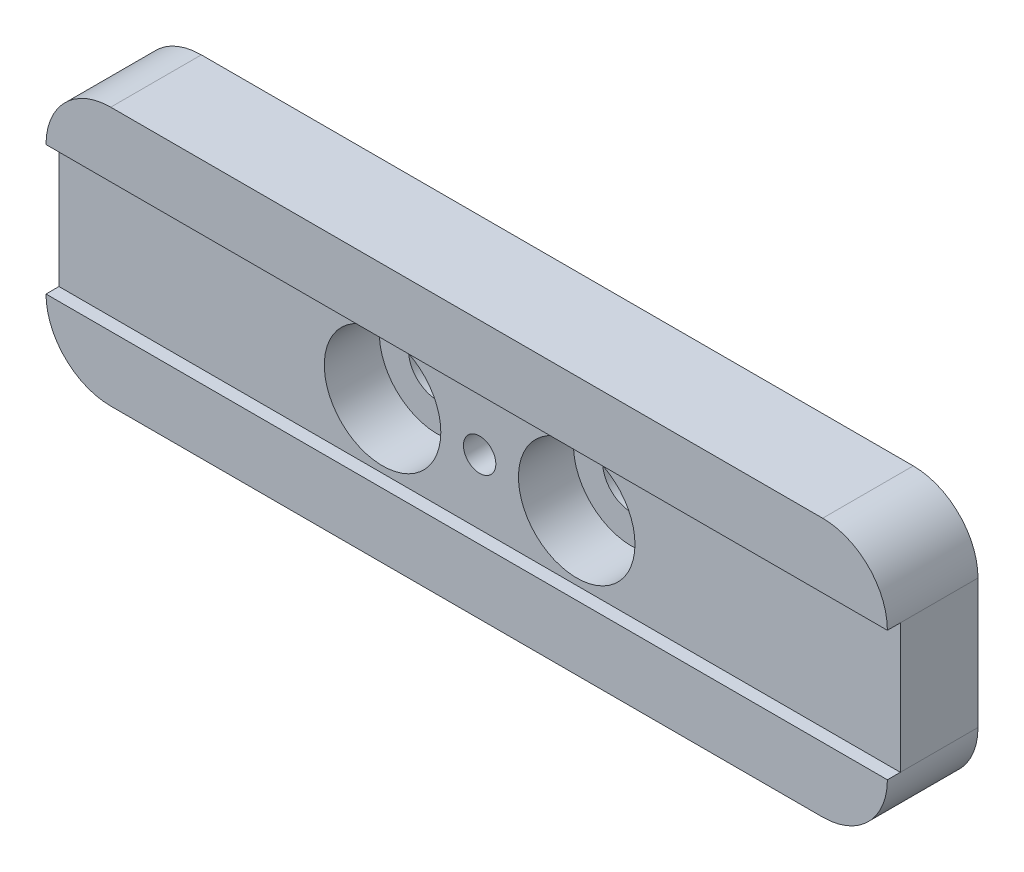
ISO-10303-21;
HEADER;
FILE_DESCRIPTION(('STEP AP214'),'2;1');
FILE_NAME('part.step','',(''),(''),'','','');
FILE_SCHEMA(('AUTOMOTIVE_DESIGN { 1 0 10303 214 1 1 1 1 }'));
ENDSEC;
DATA;
#1=APPLICATION_CONTEXT('core data for automotive mechanical design processes');
#2=APPLICATION_PROTOCOL_DEFINITION('international standard','automotive_design',2000,#1);
#3=PRODUCT_CONTEXT('',#1,'mechanical');
#4=PRODUCT('Part','Part','',(#3));
#5=PRODUCT_RELATED_PRODUCT_CATEGORY('part','',(#4));
#6=PRODUCT_DEFINITION_FORMATION('','',#4);
#7=PRODUCT_DEFINITION_CONTEXT('part definition',#1,'design');
#8=PRODUCT_DEFINITION('design','',#6,#7);
#9=PRODUCT_DEFINITION_SHAPE('','',#8);
#10=(LENGTH_UNIT() NAMED_UNIT(*) SI_UNIT(.MILLI.,.METRE.));
#11=(NAMED_UNIT(*) PLANE_ANGLE_UNIT() SI_UNIT($,.RADIAN.));
#12=(NAMED_UNIT(*) SI_UNIT($,.STERADIAN.) SOLID_ANGLE_UNIT());
#13=UNCERTAINTY_MEASURE_WITH_UNIT(LENGTH_MEASURE(1.E-05),#10,'distance_accuracy_value','');
#14=(GEOMETRIC_REPRESENTATION_CONTEXT(3) GLOBAL_UNCERTAINTY_ASSIGNED_CONTEXT((#13)) GLOBAL_UNIT_ASSIGNED_CONTEXT((#10,
#11,#12)) REPRESENTATION_CONTEXT('',''));
#15=CARTESIAN_POINT('',(0.,0.,0.));
#16=DIRECTION('',(0.,0.,1.));
#17=DIRECTION('',(1.,0.,0.));
#18=AXIS2_PLACEMENT_3D('',#15,#16,#17);
#19=CARTESIAN_POINT('',(-65.,0.,14.));
#20=DIRECTION('',(0.,0.,1.));
#21=DIRECTION('',(1.,0.,0.));
#22=AXIS2_PLACEMENT_3D('',#19,#20,#21);
#23=PLANE('',#22);
#24=DIRECTION('',(1.,0.,0.));
#25=VECTOR('',#24,1.);
#26=CARTESIAN_POINT('',(-65.,0.,14.));
#27=LINE('',#26,#25);
#28=CARTESIAN_POINT('',(-55.,0.,14.));
#29=VERTEX_POINT('',#28);
#30=CARTESIAN_POINT('',(55.,0.,14.));
#31=VERTEX_POINT('',#30);
#32=EDGE_CURVE('E159',#29,#31,#27,.T.);
#33=ORIENTED_EDGE('',*,*,#32,.T.);
#34=CARTESIAN_POINT('',(55.,10.,14.));
#35=DIRECTION('',(0.,0.,1.));
#36=DIRECTION('',(1.,0.,0.));
#37=AXIS2_PLACEMENT_3D('',#34,#35,#36);
#38=CIRCLE('',#37,10.);
#39=CARTESIAN_POINT('',(65.,10.,14.));
#40=VERTEX_POINT('',#39);
#41=EDGE_CURVE('E190',#31,#40,#38,.T.);
#42=ORIENTED_EDGE('',*,*,#41,.T.);
#43=DIRECTION('',(1.,0.,0.));
#44=VECTOR('',#43,1.);
#45=CARTESIAN_POINT('',(-65.,10.,14.));
#46=LINE('',#45,#44);
#47=CARTESIAN_POINT('',(-65.,10.,14.));
#48=VERTEX_POINT('',#47);
#49=EDGE_CURVE('E144',#48,#40,#46,.T.);
#50=ORIENTED_EDGE('',*,*,#49,.F.);
#51=CARTESIAN_POINT('',(-55.,10.,14.));
#52=DIRECTION('',(0.,0.,1.));
#53=DIRECTION('',(1.,0.,0.));
#54=AXIS2_PLACEMENT_3D('',#51,#52,#53);
#55=CIRCLE('',#54,10.);
#56=EDGE_CURVE('E188',#48,#29,#55,.T.);
#57=ORIENTED_EDGE('',*,*,#56,.T.);
#58=EDGE_LOOP('',(#33,#42,#50,#57));
#59=FACE_BOUND('',#58,.T.);
#60=ADVANCED_FACE('F34',(#59),#23,.T.);
#61=CARTESIAN_POINT('',(-65.,40.,14.));
#62=DIRECTION('',(1.,0.,0.));
#63=DIRECTION('',(0.,0.,-1.));
#64=AXIS2_PLACEMENT_3D('',#61,#62,#63);
#65=PLANE('',#64);
#66=DIRECTION('',(0.,-1.,0.));
#67=VECTOR('',#66,1.);
#68=CARTESIAN_POINT('',(-65.,40.,0.));
#69=LINE('',#68,#67);
#70=CARTESIAN_POINT('',(-65.,30.,0.));
#71=VERTEX_POINT('',#70);
#72=CARTESIAN_POINT('',(-65.,10.,0.));
#73=VERTEX_POINT('',#72);
#74=EDGE_CURVE('E157',#71,#73,#69,.T.);
#75=ORIENTED_EDGE('',*,*,#74,.T.);
#76=DIRECTION('',(0.,0.,-1.));
#77=VECTOR('',#76,1.);
#78=CARTESIAN_POINT('',(-65.,10.,14.));
#79=LINE('',#78,#77);
#80=CARTESIAN_POINT('',(-65.,10.,12.));
#81=VERTEX_POINT('',#80);
#82=EDGE_CURVE('E11',#73,#81,#79,.F.);
#83=ORIENTED_EDGE('',*,*,#82,.T.);
#84=DIRECTION('',(0.,-1.,0.));
#85=VECTOR('',#84,1.);
#86=CARTESIAN_POINT('',(-65.,10.,12.));
#87=LINE('',#86,#85);
#88=CARTESIAN_POINT('',(-65.,30.,12.));
#89=VERTEX_POINT('',#88);
#90=EDGE_CURVE('E137',#89,#81,#87,.T.);
#91=ORIENTED_EDGE('',*,*,#90,.F.);
#92=DIRECTION('',(0.,0.,-1.));
#93=VECTOR('',#92,1.);
#94=CARTESIAN_POINT('',(-65.,30.,14.));
#95=LINE('',#94,#93);
#96=EDGE_CURVE('E42',#89,#71,#95,.T.);
#97=ORIENTED_EDGE('',*,*,#96,.T.);
#98=EDGE_LOOP('',(#75,#83,#91,#97));
#99=FACE_BOUND('',#98,.T.);
#100=ADVANCED_FACE('F200',(#99),#65,.F.);
#101=CARTESIAN_POINT('',(-65.,0.,14.));
#102=DIRECTION('',(0.,1.,0.));
#103=DIRECTION('',(0.,0.,1.));
#104=AXIS2_PLACEMENT_3D('',#101,#102,#103);
#105=PLANE('',#104);
#106=DIRECTION('',(1.,0.,0.));
#107=VECTOR('',#106,1.);
#108=CARTESIAN_POINT('',(-65.,0.,0.));
#109=LINE('',#108,#107);
#110=CARTESIAN_POINT('',(-55.,0.,0.));
#111=VERTEX_POINT('',#110);
#112=CARTESIAN_POINT('',(55.,0.,0.));
#113=VERTEX_POINT('',#112);
#114=EDGE_CURVE('E166',#111,#113,#109,.T.);
#115=ORIENTED_EDGE('',*,*,#114,.T.);
#116=DIRECTION('',(0.,0.,-1.));
#117=VECTOR('',#116,1.);
#118=CARTESIAN_POINT('',(55.,0.,14.));
#119=LINE('',#118,#117);
#120=EDGE_CURVE('E186',#113,#31,#119,.F.);
#121=ORIENTED_EDGE('',*,*,#120,.T.);
#122=ORIENTED_EDGE('',*,*,#32,.F.);
#123=DIRECTION('',(0.,0.,-1.));
#124=VECTOR('',#123,1.);
#125=CARTESIAN_POINT('',(-55.,0.,14.));
#126=LINE('',#125,#124);
#127=EDGE_CURVE('E183',#29,#111,#126,.T.);
#128=ORIENTED_EDGE('',*,*,#127,.T.);
#129=EDGE_LOOP('',(#115,#121,#122,#128));
#130=FACE_BOUND('',#129,.T.);
#131=ADVANCED_FACE('F234',(#130),#105,.F.);
#132=CARTESIAN_POINT('',(65.,40.,14.));
#133=DIRECTION('',(-1.,0.,0.));
#134=DIRECTION('',(0.,0.,1.));
#135=AXIS2_PLACEMENT_3D('',#132,#133,#134);
#136=PLANE('',#135);
#137=DIRECTION('',(0.,1.,0.));
#138=VECTOR('',#137,1.);
#139=CARTESIAN_POINT('',(65.,10.,12.));
#140=LINE('',#139,#138);
#141=CARTESIAN_POINT('',(65.,10.,12.));
#142=VERTEX_POINT('',#141);
#143=CARTESIAN_POINT('',(65.,30.,12.));
#144=VERTEX_POINT('',#143);
#145=EDGE_CURVE('E117',#142,#144,#140,.T.);
#146=ORIENTED_EDGE('',*,*,#145,.F.);
#147=DIRECTION('',(0.,0.,-1.));
#148=VECTOR('',#147,1.);
#149=CARTESIAN_POINT('',(65.,10.,14.));
#150=LINE('',#149,#148);
#151=CARTESIAN_POINT('',(65.,10.,0.));
#152=VERTEX_POINT('',#151);
#153=EDGE_CURVE('E122',#142,#152,#150,.T.);
#154=ORIENTED_EDGE('',*,*,#153,.T.);
#155=DIRECTION('',(0.,1.,0.));
#156=VECTOR('',#155,1.);
#157=CARTESIAN_POINT('',(65.,40.,0.));
#158=LINE('',#157,#156);
#159=CARTESIAN_POINT('',(65.,30.,0.));
#160=VERTEX_POINT('',#159);
#161=EDGE_CURVE('E119',#152,#160,#158,.T.);
#162=ORIENTED_EDGE('',*,*,#161,.T.);
#163=DIRECTION('',(0.,0.,-1.));
#164=VECTOR('',#163,1.);
#165=CARTESIAN_POINT('',(65.,30.,14.));
#166=LINE('',#165,#164);
#167=EDGE_CURVE('E113',#160,#144,#166,.F.);
#168=ORIENTED_EDGE('',*,*,#167,.T.);
#169=EDGE_LOOP('',(#146,#154,#162,#168));
#170=FACE_BOUND('',#169,.T.);
#171=ADVANCED_FACE('F115',(#170),#136,.F.);
#172=CARTESIAN_POINT('',(-65.,40.,14.));
#173=DIRECTION('',(0.,-1.,0.));
#174=DIRECTION('',(0.,0.,-1.));
#175=AXIS2_PLACEMENT_3D('',#172,#173,#174);
#176=PLANE('',#175);
#177=DIRECTION('',(-1.,0.,0.));
#178=VECTOR('',#177,1.);
#179=CARTESIAN_POINT('',(-65.,40.,14.));
#180=LINE('',#179,#178);
#181=CARTESIAN_POINT('',(55.,40.,14.));
#182=VERTEX_POINT('',#181);
#183=CARTESIAN_POINT('',(-55.,40.,14.));
#184=VERTEX_POINT('',#183);
#185=EDGE_CURVE('E123',#182,#184,#180,.T.);
#186=ORIENTED_EDGE('',*,*,#185,.F.);
#187=DIRECTION('',(0.,0.,-1.));
#188=VECTOR('',#187,1.);
#189=CARTESIAN_POINT('',(55.,40.,14.));
#190=LINE('',#189,#188);
#191=CARTESIAN_POINT('',(55.,40.,0.));
#192=VERTEX_POINT('',#191);
#193=EDGE_CURVE('E193',#182,#192,#190,.T.);
#194=ORIENTED_EDGE('',*,*,#193,.T.);
#195=DIRECTION('',(-1.,0.,0.));
#196=VECTOR('',#195,1.);
#197=CARTESIAN_POINT('',(-65.,40.,0.));
#198=LINE('',#197,#196);
#199=CARTESIAN_POINT('',(-55.,40.,0.));
#200=VERTEX_POINT('',#199);
#201=EDGE_CURVE('E162',#192,#200,#198,.T.);
#202=ORIENTED_EDGE('',*,*,#201,.T.);
#203=DIRECTION('',(0.,0.,-1.));
#204=VECTOR('',#203,1.);
#205=CARTESIAN_POINT('',(-55.,40.,14.));
#206=LINE('',#205,#204);
#207=EDGE_CURVE('E49',#200,#184,#206,.F.);
#208=ORIENTED_EDGE('',*,*,#207,.T.);
#209=EDGE_LOOP('',(#186,#194,#202,#208));
#210=FACE_BOUND('',#209,.T.);
#211=ADVANCED_FACE('F259',(#210),#176,.F.);
#212=DIRECTION('',(-1.,0.,0.));
#213=VECTOR('',#212,1.);
#214=CARTESIAN_POINT('',(-65.,30.,14.));
#215=LINE('',#214,#213);
#216=CARTESIAN_POINT('',(65.,30.,14.));
#217=VERTEX_POINT('',#216);
#218=CARTESIAN_POINT('',(-65.,30.,14.));
#219=VERTEX_POINT('',#218);
#220=EDGE_CURVE('E210',#217,#219,#215,.T.);
#221=ORIENTED_EDGE('',*,*,#220,.F.);
#222=CARTESIAN_POINT('',(55.,30.,14.));
#223=DIRECTION('',(0.,0.,1.));
#224=DIRECTION('',(1.,0.,0.));
#225=AXIS2_PLACEMENT_3D('',#222,#223,#224);
#226=CIRCLE('',#225,10.);
#227=EDGE_CURVE('E56',#217,#182,#226,.T.);
#228=ORIENTED_EDGE('',*,*,#227,.T.);
#229=ORIENTED_EDGE('',*,*,#185,.T.);
#230=CARTESIAN_POINT('',(-55.,30.,14.));
#231=DIRECTION('',(0.,0.,1.));
#232=DIRECTION('',(1.,0.,0.));
#233=AXIS2_PLACEMENT_3D('',#230,#231,#232);
#234=CIRCLE('',#233,10.);
#235=EDGE_CURVE('E196',#184,#219,#234,.T.);
#236=ORIENTED_EDGE('',*,*,#235,.T.);
#237=EDGE_LOOP('',(#221,#228,#229,#236));
#238=FACE_BOUND('',#237,.T.);
#239=ADVANCED_FACE('F209',(#238),#23,.T.);
#240=CARTESIAN_POINT('',(-65.,0.,0.));
#241=DIRECTION('',(0.,0.,1.));
#242=DIRECTION('',(1.,0.,0.));
#243=AXIS2_PLACEMENT_3D('',#240,#241,#242);
#244=PLANE('',#243);
#245=CARTESIAN_POINT('',(-15.,20.,0.));
#246=DIRECTION('',(0.,0.,1.));
#247=DIRECTION('',(1.,0.,0.));
#248=AXIS2_PLACEMENT_3D('',#245,#246,#247);
#249=CIRCLE('',#248,4.5);
#250=CARTESIAN_POINT('',(-10.5,20.,0.));
#251=VERTEX_POINT('',#250);
#252=EDGE_CURVE('E439',#251,#251,#249,.T.);
#253=ORIENTED_EDGE('',*,*,#252,.T.);
#254=EDGE_LOOP('',(#253));
#255=FACE_BOUND('',#254,.T.);
#256=CARTESIAN_POINT('',(15.,20.,0.));
#257=DIRECTION('',(0.,0.,1.));
#258=DIRECTION('',(1.,0.,0.));
#259=AXIS2_PLACEMENT_3D('',#256,#257,#258);
#260=CIRCLE('',#259,4.5);
#261=CARTESIAN_POINT('',(19.5,20.,0.));
#262=VERTEX_POINT('',#261);
#263=EDGE_CURVE('E211',#262,#262,#260,.T.);
#264=ORIENTED_EDGE('',*,*,#263,.T.);
#265=EDGE_LOOP('',(#264));
#266=FACE_BOUND('',#265,.T.);
#267=CARTESIAN_POINT('',(0.,20.,0.));
#268=DIRECTION('',(0.,0.,1.));
#269=DIRECTION('',(1.,0.,0.));
#270=AXIS2_PLACEMENT_3D('',#267,#268,#269);
#271=CIRCLE('',#270,2.5);
#272=CARTESIAN_POINT('',(2.5,20.,0.));
#273=VERTEX_POINT('',#272);
#274=EDGE_CURVE('E154',#273,#273,#271,.T.);
#275=ORIENTED_EDGE('',*,*,#274,.T.);
#276=EDGE_LOOP('',(#275));
#277=FACE_BOUND('',#276,.T.);
#278=ORIENTED_EDGE('',*,*,#161,.F.);
#279=CARTESIAN_POINT('',(55.,10.,0.));
#280=DIRECTION('',(0.,0.,1.));
#281=DIRECTION('',(1.,0.,0.));
#282=AXIS2_PLACEMENT_3D('',#279,#280,#281);
#283=CIRCLE('',#282,10.);
#284=EDGE_CURVE('E181',#152,#113,#283,.F.);
#285=ORIENTED_EDGE('',*,*,#284,.T.);
#286=ORIENTED_EDGE('',*,*,#114,.F.);
#287=CARTESIAN_POINT('',(-55.,10.,0.));
#288=DIRECTION('',(0.,0.,1.));
#289=DIRECTION('',(1.,0.,0.));
#290=AXIS2_PLACEMENT_3D('',#287,#288,#289);
#291=CIRCLE('',#290,10.);
#292=EDGE_CURVE('E177',#111,#73,#291,.F.);
#293=ORIENTED_EDGE('',*,*,#292,.T.);
#294=ORIENTED_EDGE('',*,*,#74,.F.);
#295=CARTESIAN_POINT('',(-55.,30.,0.));
#296=DIRECTION('',(0.,0.,1.));
#297=DIRECTION('',(1.,0.,0.));
#298=AXIS2_PLACEMENT_3D('',#295,#296,#297);
#299=CIRCLE('',#298,10.);
#300=EDGE_CURVE('E175',#71,#200,#299,.F.);
#301=ORIENTED_EDGE('',*,*,#300,.T.);
#302=ORIENTED_EDGE('',*,*,#201,.F.);
#303=CARTESIAN_POINT('',(55.,30.,0.));
#304=DIRECTION('',(0.,0.,1.));
#305=DIRECTION('',(1.,0.,0.));
#306=AXIS2_PLACEMENT_3D('',#303,#304,#305);
#307=CIRCLE('',#306,10.);
#308=EDGE_CURVE('E179',#192,#160,#307,.F.);
#309=ORIENTED_EDGE('',*,*,#308,.T.);
#310=EDGE_LOOP('',(#278,#285,#286,#293,#294,#301,#302,#309));
#311=FACE_BOUND('',#310,.T.);
#312=ADVANCED_FACE('F205',(#255,#266,#277,#311),#244,.F.);
#313=CARTESIAN_POINT('',(0.,20.,14.));
#314=DIRECTION('',(0.,0.,1.));
#315=DIRECTION('',(1.,0.,0.));
#316=AXIS2_PLACEMENT_3D('',#313,#314,#315);
#317=CYLINDRICAL_SURFACE('',#316,2.5);
#318=CARTESIAN_POINT('',(0.,20.,12.));
#319=DIRECTION('',(0.,0.,-1.));
#320=DIRECTION('',(-1.,0.,0.));
#321=AXIS2_PLACEMENT_3D('',#318,#319,#320);
#322=CIRCLE('',#321,2.5);
#323=CARTESIAN_POINT('',(-2.5,20.,12.));
#324=VERTEX_POINT('',#323);
#325=EDGE_CURVE('E158',#324,#324,#322,.F.);
#326=ORIENTED_EDGE('',*,*,#325,.T.);
#327=EDGE_LOOP('',(#326));
#328=FACE_BOUND('',#327,.T.);
#329=ORIENTED_EDGE('',*,*,#274,.F.);
#330=EDGE_LOOP('',(#329));
#331=FACE_BOUND('',#330,.T.);
#332=ADVANCED_FACE('F264',(#328,#331),#317,.F.);
#333=CARTESIAN_POINT('',(65.,30.,12.));
#334=DIRECTION('',(0.,0.,-1.));
#335=DIRECTION('',(-1.,0.,0.));
#336=AXIS2_PLACEMENT_3D('',#333,#334,#335);
#337=PLANE('',#336);
#338=CARTESIAN_POINT('',(-15.,20.,12.));
#339=DIRECTION('',(0.,0.,1.));
#340=DIRECTION('',(1.,0.,0.));
#341=AXIS2_PLACEMENT_3D('',#338,#339,#340);
#342=CIRCLE('',#341,9.);
#343=CARTESIAN_POINT('',(-6.,20.,12.));
#344=VERTEX_POINT('',#343);
#345=EDGE_CURVE('E448',#344,#344,#342,.T.);
#346=ORIENTED_EDGE('',*,*,#345,.F.);
#347=EDGE_LOOP('',(#346));
#348=FACE_BOUND('',#347,.T.);
#349=CARTESIAN_POINT('',(15.,20.,12.));
#350=DIRECTION('',(0.,0.,1.));
#351=DIRECTION('',(1.,0.,0.));
#352=AXIS2_PLACEMENT_3D('',#349,#350,#351);
#353=CIRCLE('',#352,9.);
#354=CARTESIAN_POINT('',(24.,20.,12.));
#355=VERTEX_POINT('',#354);
#356=EDGE_CURVE('E434',#355,#355,#353,.T.);
#357=ORIENTED_EDGE('',*,*,#356,.F.);
#358=EDGE_LOOP('',(#357));
#359=FACE_BOUND('',#358,.T.);
#360=ORIENTED_EDGE('',*,*,#145,.T.);
#361=DIRECTION('',(-1.,0.,0.));
#362=VECTOR('',#361,1.);
#363=CARTESIAN_POINT('',(-65.,30.,12.));
#364=LINE('',#363,#362);
#365=EDGE_CURVE('E128',#144,#89,#364,.T.);
#366=ORIENTED_EDGE('',*,*,#365,.T.);
#367=ORIENTED_EDGE('',*,*,#90,.T.);
#368=DIRECTION('',(1.,0.,0.));
#369=VECTOR('',#368,1.);
#370=CARTESIAN_POINT('',(-65.,10.,12.));
#371=LINE('',#370,#369);
#372=EDGE_CURVE('E143',#81,#142,#371,.T.);
#373=ORIENTED_EDGE('',*,*,#372,.T.);
#374=EDGE_LOOP('',(#360,#366,#367,#373));
#375=FACE_BOUND('',#374,.T.);
#376=ORIENTED_EDGE('',*,*,#325,.F.);
#377=EDGE_LOOP('',(#376));
#378=FACE_BOUND('',#377,.T.);
#379=ADVANCED_FACE('F140',(#348,#359,#375,#378),#337,.F.);
#380=CARTESIAN_POINT('',(-65.,10.,12.));
#381=DIRECTION('',(0.,-1.,0.));
#382=DIRECTION('',(0.,0.,-1.));
#383=AXIS2_PLACEMENT_3D('',#380,#381,#382);
#384=PLANE('',#383);
#385=ORIENTED_EDGE('',*,*,#49,.T.);
#386=DIRECTION('',(0.,0.,1.));
#387=VECTOR('',#386,1.);
#388=CARTESIAN_POINT('',(65.,10.,12.));
#389=LINE('',#388,#387);
#390=EDGE_CURVE('E172',#142,#40,#389,.T.);
#391=ORIENTED_EDGE('',*,*,#390,.F.);
#392=ORIENTED_EDGE('',*,*,#372,.F.);
#393=DIRECTION('',(0.,0.,1.));
#394=VECTOR('',#393,1.);
#395=CARTESIAN_POINT('',(-65.,10.,12.));
#396=LINE('',#395,#394);
#397=EDGE_CURVE('E149',#81,#48,#396,.T.);
#398=ORIENTED_EDGE('',*,*,#397,.T.);
#399=EDGE_LOOP('',(#385,#391,#392,#398));
#400=FACE_BOUND('',#399,.T.);
#401=ADVANCED_FACE('F224',(#400),#384,.F.);
#402=CARTESIAN_POINT('',(-65.,30.,12.));
#403=DIRECTION('',(0.,1.,0.));
#404=DIRECTION('',(0.,0.,1.));
#405=AXIS2_PLACEMENT_3D('',#402,#403,#404);
#406=PLANE('',#405);
#407=ORIENTED_EDGE('',*,*,#220,.T.);
#408=DIRECTION('',(0.,0.,1.));
#409=VECTOR('',#408,1.);
#410=CARTESIAN_POINT('',(-65.,30.,12.));
#411=LINE('',#410,#409);
#412=EDGE_CURVE('E133',#89,#219,#411,.T.);
#413=ORIENTED_EDGE('',*,*,#412,.F.);
#414=ORIENTED_EDGE('',*,*,#365,.F.);
#415=DIRECTION('',(0.,0.,1.));
#416=VECTOR('',#415,1.);
#417=CARTESIAN_POINT('',(65.,30.,12.));
#418=LINE('',#417,#416);
#419=EDGE_CURVE('E131',#144,#217,#418,.T.);
#420=ORIENTED_EDGE('',*,*,#419,.T.);
#421=EDGE_LOOP('',(#407,#413,#414,#420));
#422=FACE_BOUND('',#421,.T.);
#423=ADVANCED_FACE('F130',(#422),#406,.F.);
#424=CARTESIAN_POINT('',(15.,20.,12.));
#425=DIRECTION('',(0.,0.,1.));
#426=DIRECTION('',(1.,0.,0.));
#427=AXIS2_PLACEMENT_3D('',#424,#425,#426);
#428=CYLINDRICAL_SURFACE('',#427,4.5);
#429=ORIENTED_EDGE('',*,*,#263,.F.);
#430=EDGE_LOOP('',(#429));
#431=FACE_BOUND('',#430,.T.);
#432=CARTESIAN_POINT('',(15.,20.,3.5));
#433=DIRECTION('',(0.,0.,1.));
#434=DIRECTION('',(1.,0.,0.));
#435=AXIS2_PLACEMENT_3D('',#432,#433,#434);
#436=CIRCLE('',#435,4.5);
#437=CARTESIAN_POINT('',(19.5,20.,3.5));
#438=VERTEX_POINT('',#437);
#439=EDGE_CURVE('E216',#438,#438,#436,.T.);
#440=ORIENTED_EDGE('',*,*,#439,.T.);
#441=EDGE_LOOP('',(#440));
#442=FACE_BOUND('',#441,.T.);
#443=ADVANCED_FACE('F323',(#431,#442),#428,.F.);
#444=CARTESIAN_POINT('',(19.5,20.,3.5));
#445=DIRECTION('',(0.,0.,-1.));
#446=DIRECTION('',(-1.,0.,0.));
#447=AXIS2_PLACEMENT_3D('',#444,#445,#446);
#448=PLANE('',#447);
#449=ORIENTED_EDGE('',*,*,#439,.F.);
#450=EDGE_LOOP('',(#449));
#451=FACE_BOUND('',#450,.T.);
#452=CARTESIAN_POINT('',(15.,20.,3.5));
#453=DIRECTION('',(0.,0.,1.));
#454=DIRECTION('',(1.,0.,0.));
#455=AXIS2_PLACEMENT_3D('',#452,#453,#454);
#456=CIRCLE('',#455,9.);
#457=CARTESIAN_POINT('',(24.,20.,3.5));
#458=VERTEX_POINT('',#457);
#459=EDGE_CURVE('E431',#458,#458,#456,.T.);
#460=ORIENTED_EDGE('',*,*,#459,.T.);
#461=EDGE_LOOP('',(#460));
#462=FACE_BOUND('',#461,.T.);
#463=ADVANCED_FACE('F383',(#451,#462),#448,.F.);
#464=CARTESIAN_POINT('',(15.,20.,12.));
#465=DIRECTION('',(0.,0.,1.));
#466=DIRECTION('',(1.,0.,0.));
#467=AXIS2_PLACEMENT_3D('',#464,#465,#466);
#468=CYLINDRICAL_SURFACE('',#467,9.);
#469=ORIENTED_EDGE('',*,*,#459,.F.);
#470=EDGE_LOOP('',(#469));
#471=FACE_BOUND('',#470,.T.);
#472=ORIENTED_EDGE('',*,*,#356,.T.);
#473=EDGE_LOOP('',(#472));
#474=FACE_BOUND('',#473,.T.);
#475=ADVANCED_FACE('F374',(#471,#474),#468,.F.);
#476=CARTESIAN_POINT('',(-15.,20.,12.));
#477=DIRECTION('',(0.,0.,1.));
#478=DIRECTION('',(1.,0.,0.));
#479=AXIS2_PLACEMENT_3D('',#476,#477,#478);
#480=CYLINDRICAL_SURFACE('',#479,4.5);
#481=ORIENTED_EDGE('',*,*,#252,.F.);
#482=EDGE_LOOP('',(#481));
#483=FACE_BOUND('',#482,.T.);
#484=CARTESIAN_POINT('',(-15.,20.,3.5));
#485=DIRECTION('',(0.,0.,1.));
#486=DIRECTION('',(1.,0.,0.));
#487=AXIS2_PLACEMENT_3D('',#484,#485,#486);
#488=CIRCLE('',#487,4.5);
#489=CARTESIAN_POINT('',(-10.5,20.,3.5));
#490=VERTEX_POINT('',#489);
#491=EDGE_CURVE('E442',#490,#490,#488,.T.);
#492=ORIENTED_EDGE('',*,*,#491,.T.);
#493=EDGE_LOOP('',(#492));
#494=FACE_BOUND('',#493,.T.);
#495=ADVANCED_FACE('F365',(#483,#494),#480,.F.);
#496=CARTESIAN_POINT('',(-10.5,20.,3.5));
#497=DIRECTION('',(0.,0.,-1.));
#498=DIRECTION('',(-1.,0.,0.));
#499=AXIS2_PLACEMENT_3D('',#496,#497,#498);
#500=PLANE('',#499);
#501=ORIENTED_EDGE('',*,*,#491,.F.);
#502=EDGE_LOOP('',(#501));
#503=FACE_BOUND('',#502,.T.);
#504=CARTESIAN_POINT('',(-15.,20.,3.5));
#505=DIRECTION('',(0.,0.,1.));
#506=DIRECTION('',(1.,0.,0.));
#507=AXIS2_PLACEMENT_3D('',#504,#505,#506);
#508=CIRCLE('',#507,9.);
#509=CARTESIAN_POINT('',(-6.,20.,3.5));
#510=VERTEX_POINT('',#509);
#511=EDGE_CURVE('E445',#510,#510,#508,.T.);
#512=ORIENTED_EDGE('',*,*,#511,.T.);
#513=EDGE_LOOP('',(#512));
#514=FACE_BOUND('',#513,.T.);
#515=ADVANCED_FACE('F247',(#503,#514),#500,.F.);
#516=CARTESIAN_POINT('',(-15.,20.,12.));
#517=DIRECTION('',(0.,0.,1.));
#518=DIRECTION('',(1.,0.,0.));
#519=AXIS2_PLACEMENT_3D('',#516,#517,#518);
#520=CYLINDRICAL_SURFACE('',#519,9.);
#521=ORIENTED_EDGE('',*,*,#511,.F.);
#522=EDGE_LOOP('',(#521));
#523=FACE_BOUND('',#522,.T.);
#524=ORIENTED_EDGE('',*,*,#345,.T.);
#525=EDGE_LOOP('',(#524));
#526=FACE_BOUND('',#525,.T.);
#527=ADVANCED_FACE('F240',(#523,#526),#520,.F.);
#528=CARTESIAN_POINT('',(55.,10.,14.));
#529=DIRECTION('',(0.,0.,-1.));
#530=DIRECTION('',(-1.,0.,0.));
#531=AXIS2_PLACEMENT_3D('',#528,#529,#530);
#532=CYLINDRICAL_SURFACE('',#531,10.);
#533=ORIENTED_EDGE('',*,*,#41,.F.);
#534=ORIENTED_EDGE('',*,*,#120,.F.);
#535=ORIENTED_EDGE('',*,*,#284,.F.);
#536=ORIENTED_EDGE('',*,*,#153,.F.);
#537=ORIENTED_EDGE('',*,*,#390,.T.);
#538=EDGE_LOOP('',(#533,#534,#535,#536,#537));
#539=FACE_BOUND('',#538,.T.);
#540=ADVANCED_FACE('F238',(#539),#532,.T.);
#541=CARTESIAN_POINT('',(55.,30.,14.));
#542=DIRECTION('',(0.,0.,-1.));
#543=DIRECTION('',(-1.,0.,0.));
#544=AXIS2_PLACEMENT_3D('',#541,#542,#543);
#545=CYLINDRICAL_SURFACE('',#544,10.);
#546=ORIENTED_EDGE('',*,*,#419,.F.);
#547=ORIENTED_EDGE('',*,*,#167,.F.);
#548=ORIENTED_EDGE('',*,*,#308,.F.);
#549=ORIENTED_EDGE('',*,*,#193,.F.);
#550=ORIENTED_EDGE('',*,*,#227,.F.);
#551=EDGE_LOOP('',(#546,#547,#548,#549,#550));
#552=FACE_BOUND('',#551,.T.);
#553=ADVANCED_FACE('F146',(#552),#545,.T.);
#554=CARTESIAN_POINT('',(-55.,10.,14.));
#555=DIRECTION('',(0.,0.,-1.));
#556=DIRECTION('',(-1.,0.,0.));
#557=AXIS2_PLACEMENT_3D('',#554,#555,#556);
#558=CYLINDRICAL_SURFACE('',#557,10.);
#559=ORIENTED_EDGE('',*,*,#397,.F.);
#560=ORIENTED_EDGE('',*,*,#82,.F.);
#561=ORIENTED_EDGE('',*,*,#292,.F.);
#562=ORIENTED_EDGE('',*,*,#127,.F.);
#563=ORIENTED_EDGE('',*,*,#56,.F.);
#564=EDGE_LOOP('',(#559,#560,#561,#562,#563));
#565=FACE_BOUND('',#564,.T.);
#566=ADVANCED_FACE('F232',(#565),#558,.T.);
#567=CARTESIAN_POINT('',(-55.,30.,14.));
#568=DIRECTION('',(0.,0.,-1.));
#569=DIRECTION('',(-1.,0.,0.));
#570=AXIS2_PLACEMENT_3D('',#567,#568,#569);
#571=CYLINDRICAL_SURFACE('',#570,10.);
#572=ORIENTED_EDGE('',*,*,#235,.F.);
#573=ORIENTED_EDGE('',*,*,#207,.F.);
#574=ORIENTED_EDGE('',*,*,#300,.F.);
#575=ORIENTED_EDGE('',*,*,#96,.F.);
#576=ORIENTED_EDGE('',*,*,#412,.T.);
#577=EDGE_LOOP('',(#572,#573,#574,#575,#576));
#578=FACE_BOUND('',#577,.T.);
#579=ADVANCED_FACE('F36',(#578),#571,.T.);
#580=CLOSED_SHELL('',(#60,#100,#131,#171,#211,#239,#312,#332,#379,#401,#423,#443,#463,#475,#495,
#515,#527,#540,#553,#566,#579));
#581=MANIFOLD_SOLID_BREP('B2',#580);
#582=ADVANCED_BREP_SHAPE_REPRESENTATION('',(#18,#581),#14);
#583=SHAPE_DEFINITION_REPRESENTATION(#9,#582);
ENDSEC;
END-ISO-10303-21;
